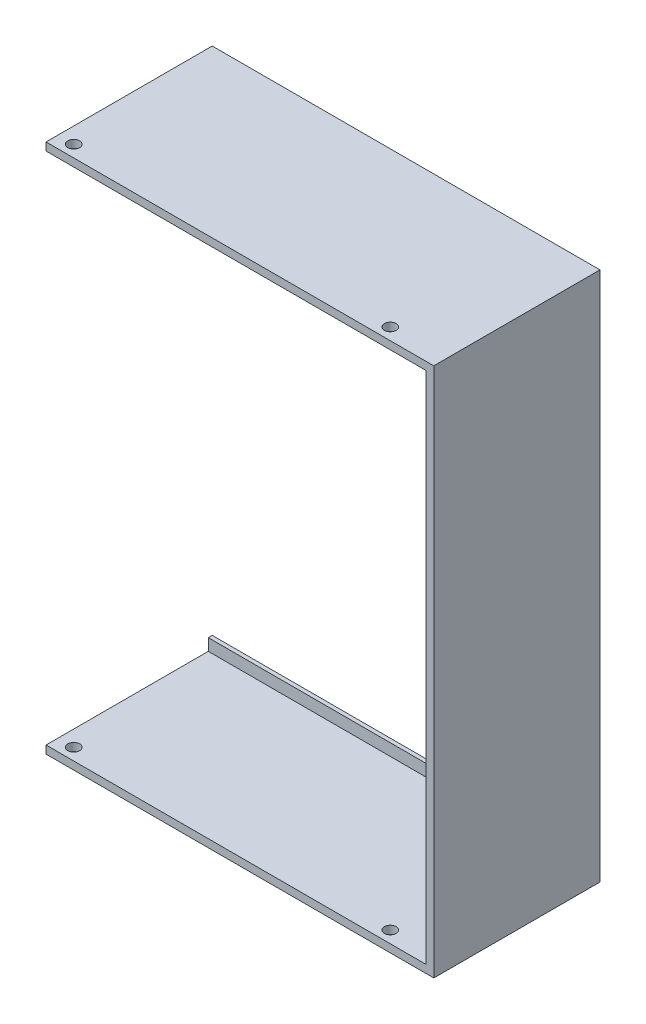
ISO-10303-21;
HEADER;
FILE_DESCRIPTION(('STEP AP214'),'2;1');
FILE_NAME('part.step','',(''),(''),'','','');
FILE_SCHEMA(('AUTOMOTIVE_DESIGN { 1 0 10303 214 1 1 1 1 }'));
ENDSEC;
DATA;
#1=APPLICATION_CONTEXT('core data for automotive mechanical design processes');
#2=APPLICATION_PROTOCOL_DEFINITION('international standard','automotive_design',2000,#1);
#3=PRODUCT_CONTEXT('',#1,'mechanical');
#4=PRODUCT('Part','Part','',(#3));
#5=PRODUCT_RELATED_PRODUCT_CATEGORY('part','',(#4));
#6=PRODUCT_DEFINITION_FORMATION('','',#4);
#7=PRODUCT_DEFINITION_CONTEXT('part definition',#1,'design');
#8=PRODUCT_DEFINITION('design','',#6,#7);
#9=PRODUCT_DEFINITION_SHAPE('','',#8);
#10=(LENGTH_UNIT() NAMED_UNIT(*) SI_UNIT(.MILLI.,.METRE.));
#11=(NAMED_UNIT(*) PLANE_ANGLE_UNIT() SI_UNIT($,.RADIAN.));
#12=(NAMED_UNIT(*) SI_UNIT($,.STERADIAN.) SOLID_ANGLE_UNIT());
#13=UNCERTAINTY_MEASURE_WITH_UNIT(LENGTH_MEASURE(1.E-05),#10,'distance_accuracy_value','');
#14=(GEOMETRIC_REPRESENTATION_CONTEXT(3) GLOBAL_UNCERTAINTY_ASSIGNED_CONTEXT((#13)) GLOBAL_UNIT_ASSIGNED_CONTEXT((#10,
#11,#12)) REPRESENTATION_CONTEXT('',''));
#15=CARTESIAN_POINT('',(0.,0.,0.));
#16=DIRECTION('',(0.,0.,1.));
#17=DIRECTION('',(1.,0.,0.));
#18=AXIS2_PLACEMENT_3D('',#15,#16,#17);
#19=CARTESIAN_POINT('',(0.,2.,0.));
#20=DIRECTION('',(0.,-1.,0.));
#21=DIRECTION('',(0.,0.,-1.));
#22=AXIS2_PLACEMENT_3D('',#19,#20,#21);
#23=PLANE('',#22);
#24=CARTESIAN_POINT('',(80.,2.,0.));
#25=DIRECTION('',(0.,1.,0.));
#26=DIRECTION('',(0.,0.,1.));
#27=AXIS2_PLACEMENT_3D('',#24,#25,#26);
#28=CIRCLE('',#27,1.5);
#29=CARTESIAN_POINT('',(80.,2.,1.5));
#30=VERTEX_POINT('',#29);
#31=EDGE_CURVE('E198',#30,#30,#28,.T.);
#32=ORIENTED_EDGE('',*,*,#31,.F.);
#33=EDGE_LOOP('',(#32));
#34=FACE_BOUND('',#33,.T.);
#35=CARTESIAN_POINT('',(0.,2.,0.));
#36=DIRECTION('',(0.,1.,0.));
#37=DIRECTION('',(0.,0.,1.));
#38=AXIS2_PLACEMENT_3D('',#35,#36,#37);
#39=CIRCLE('',#38,1.5);
#40=CARTESIAN_POINT('',(0.,2.,1.5));
#41=VERTEX_POINT('',#40);
#42=EDGE_CURVE('E204',#41,#41,#39,.T.);
#43=ORIENTED_EDGE('',*,*,#42,.F.);
#44=EDGE_LOOP('',(#43));
#45=FACE_BOUND('',#44,.T.);
#46=DIRECTION('',(0.,0.,1.));
#47=VECTOR('',#46,1.);
#48=CARTESIAN_POINT('',(92.,2.,-3.));
#49=LINE('',#48,#47);
#50=CARTESIAN_POINT('',(92.,2.,-38.));
#51=VERTEX_POINT('',#50);
#52=CARTESIAN_POINT('',(92.,2.,3.));
#53=VERTEX_POINT('',#52);
#54=EDGE_CURVE('E192',#51,#53,#49,.T.);
#55=ORIENTED_EDGE('',*,*,#54,.F.);
#56=DIRECTION('',(1.,0.,0.));
#57=VECTOR('',#56,1.);
#58=CARTESIAN_POINT('',(-4.,2.,-38.));
#59=LINE('',#58,#57);
#60=CARTESIAN_POINT('',(-4.,2.,-38.));
#61=VERTEX_POINT('',#60);
#62=EDGE_CURVE('E151',#61,#51,#59,.T.);
#63=ORIENTED_EDGE('',*,*,#62,.F.);
#64=DIRECTION('',(0.,0.,1.));
#65=VECTOR('',#64,1.);
#66=CARTESIAN_POINT('',(-4.,2.,3.));
#67=LINE('',#66,#65);
#68=CARTESIAN_POINT('',(-4.,2.,3.));
#69=VERTEX_POINT('',#68);
#70=EDGE_CURVE('E210',#61,#69,#67,.T.);
#71=ORIENTED_EDGE('',*,*,#70,.T.);
#72=DIRECTION('',(1.,0.,0.));
#73=VECTOR('',#72,1.);
#74=CARTESIAN_POINT('',(-4.,2.,3.));
#75=LINE('',#74,#73);
#76=EDGE_CURVE('E48',#69,#53,#75,.T.);
#77=ORIENTED_EDGE('',*,*,#76,.T.);
#78=EDGE_LOOP('',(#55,#63,#71,#77));
#79=FACE_BOUND('',#78,.T.);
#80=ADVANCED_FACE('F33',(#34,#45,#79),#23,.F.);
#81=CARTESIAN_POINT('',(0.,0.,0.));
#82=DIRECTION('',(0.,-1.,0.));
#83=DIRECTION('',(0.,0.,-1.));
#84=AXIS2_PLACEMENT_3D('',#81,#82,#83);
#85=PLANE('',#84);
#86=CARTESIAN_POINT('',(0.,0.,0.));
#87=DIRECTION('',(0.,1.,0.));
#88=DIRECTION('',(0.,0.,1.));
#89=AXIS2_PLACEMENT_3D('',#86,#87,#88);
#90=CIRCLE('',#89,1.5);
#91=CARTESIAN_POINT('',(0.,0.,1.5));
#92=VERTEX_POINT('',#91);
#93=EDGE_CURVE('E201',#92,#92,#90,.T.);
#94=ORIENTED_EDGE('',*,*,#93,.T.);
#95=EDGE_LOOP('',(#94));
#96=FACE_BOUND('',#95,.T.);
#97=DIRECTION('',(0.,0.,1.));
#98=VECTOR('',#97,1.);
#99=CARTESIAN_POINT('',(-4.,0.,3.));
#100=LINE('',#99,#98);
#101=CARTESIAN_POINT('',(-4.,0.,-39.));
#102=VERTEX_POINT('',#101);
#103=CARTESIAN_POINT('',(-4.,0.,3.));
#104=VERTEX_POINT('',#103);
#105=EDGE_CURVE('E207',#102,#104,#100,.T.);
#106=ORIENTED_EDGE('',*,*,#105,.F.);
#107=DIRECTION('',(-1.,0.,0.));
#108=VECTOR('',#107,1.);
#109=CARTESIAN_POINT('',(-4.,0.,-39.));
#110=LINE('',#109,#108);
#111=CARTESIAN_POINT('',(94.,0.,-39.));
#112=VERTEX_POINT('',#111);
#113=EDGE_CURVE('E143',#112,#102,#110,.T.);
#114=ORIENTED_EDGE('',*,*,#113,.F.);
#115=DIRECTION('',(0.,0.,-1.));
#116=VECTOR('',#115,1.);
#117=CARTESIAN_POINT('',(94.,0.,3.));
#118=LINE('',#117,#116);
#119=CARTESIAN_POINT('',(94.,0.,3.));
#120=VERTEX_POINT('',#119);
#121=EDGE_CURVE('E212',#120,#112,#118,.T.);
#122=ORIENTED_EDGE('',*,*,#121,.F.);
#123=DIRECTION('',(1.,0.,0.));
#124=VECTOR('',#123,1.);
#125=CARTESIAN_POINT('',(-4.,0.,3.));
#126=LINE('',#125,#124);
#127=EDGE_CURVE('E59',#104,#120,#126,.T.);
#128=ORIENTED_EDGE('',*,*,#127,.F.);
#129=EDGE_LOOP('',(#106,#114,#122,#128));
#130=FACE_BOUND('',#129,.T.);
#131=CARTESIAN_POINT('',(80.,0.,0.));
#132=DIRECTION('',(0.,1.,0.));
#133=DIRECTION('',(0.,0.,1.));
#134=AXIS2_PLACEMENT_3D('',#131,#132,#133);
#135=CIRCLE('',#134,1.5);
#136=CARTESIAN_POINT('',(80.,0.,1.5));
#137=VERTEX_POINT('',#136);
#138=EDGE_CURVE('E197',#137,#137,#135,.T.);
#139=ORIENTED_EDGE('',*,*,#138,.T.);
#140=EDGE_LOOP('',(#139));
#141=FACE_BOUND('',#140,.T.);
#142=ADVANCED_FACE('F222',(#96,#130,#141),#85,.T.);
#143=CARTESIAN_POINT('',(-4.,2.,3.));
#144=DIRECTION('',(1.,0.,0.));
#145=DIRECTION('',(0.,0.,-1.));
#146=AXIS2_PLACEMENT_3D('',#143,#144,#145);
#147=PLANE('',#146);
#148=ORIENTED_EDGE('',*,*,#105,.T.);
#149=DIRECTION('',(0.,-1.,0.));
#150=VECTOR('',#149,1.);
#151=CARTESIAN_POINT('',(-4.,2.,3.));
#152=LINE('',#151,#150);
#153=EDGE_CURVE('E11',#69,#104,#152,.T.);
#154=ORIENTED_EDGE('',*,*,#153,.F.);
#155=ORIENTED_EDGE('',*,*,#70,.F.);
#156=DIRECTION('',(0.,1.,0.));
#157=VECTOR('',#156,1.);
#158=CARTESIAN_POINT('',(-4.,0.,-38.));
#159=LINE('',#158,#157);
#160=CARTESIAN_POINT('',(-4.,5.,-38.));
#161=VERTEX_POINT('',#160);
#162=EDGE_CURVE('E149',#61,#161,#159,.T.);
#163=ORIENTED_EDGE('',*,*,#162,.T.);
#164=DIRECTION('',(0.,0.,1.));
#165=VECTOR('',#164,1.);
#166=CARTESIAN_POINT('',(-4.,5.,-39.));
#167=LINE('',#166,#165);
#168=CARTESIAN_POINT('',(-4.,5.,-39.));
#169=VERTEX_POINT('',#168);
#170=EDGE_CURVE('E130',#169,#161,#167,.T.);
#171=ORIENTED_EDGE('',*,*,#170,.F.);
#172=DIRECTION('',(0.,1.,0.));
#173=VECTOR('',#172,1.);
#174=CARTESIAN_POINT('',(-4.,0.,-39.));
#175=LINE('',#174,#173);
#176=EDGE_CURVE('E136',#102,#169,#175,.T.);
#177=ORIENTED_EDGE('',*,*,#176,.F.);
#178=EDGE_LOOP('',(#148,#154,#155,#163,#171,#177));
#179=FACE_BOUND('',#178,.T.);
#180=ADVANCED_FACE('F35',(#179),#147,.F.);
#181=CARTESIAN_POINT('',(-4.,2.,3.));
#182=DIRECTION('',(0.,0.,-1.));
#183=DIRECTION('',(-1.,0.,0.));
#184=AXIS2_PLACEMENT_3D('',#181,#182,#183);
#185=PLANE('',#184);
#186=ORIENTED_EDGE('',*,*,#127,.T.);
#187=DIRECTION('',(0.,-1.,0.));
#188=VECTOR('',#187,1.);
#189=CARTESIAN_POINT('',(94.,2.,3.));
#190=LINE('',#189,#188);
#191=CARTESIAN_POINT('',(94.,134.,3.));
#192=VERTEX_POINT('',#191);
#193=EDGE_CURVE('E42',#192,#120,#190,.T.);
#194=ORIENTED_EDGE('',*,*,#193,.F.);
#195=DIRECTION('',(1.,0.,0.));
#196=VECTOR('',#195,1.);
#197=CARTESIAN_POINT('',(94.,134.,3.));
#198=LINE('',#197,#196);
#199=CARTESIAN_POINT('',(-4.,134.,3.));
#200=VERTEX_POINT('',#199);
#201=EDGE_CURVE('E183',#200,#192,#198,.T.);
#202=ORIENTED_EDGE('',*,*,#201,.F.);
#203=DIRECTION('',(0.,-1.,0.));
#204=VECTOR('',#203,1.);
#205=CARTESIAN_POINT('',(-4.,134.,3.));
#206=LINE('',#205,#204);
#207=CARTESIAN_POINT('',(-4.,132.,3.));
#208=VERTEX_POINT('',#207);
#209=EDGE_CURVE('E186',#200,#208,#206,.T.);
#210=ORIENTED_EDGE('',*,*,#209,.T.);
#211=DIRECTION('',(1.,0.,0.));
#212=VECTOR('',#211,1.);
#213=CARTESIAN_POINT('',(94.,132.,3.));
#214=LINE('',#213,#212);
#215=CARTESIAN_POINT('',(92.,132.,3.));
#216=VERTEX_POINT('',#215);
#217=EDGE_CURVE('E181',#208,#216,#214,.T.);
#218=ORIENTED_EDGE('',*,*,#217,.T.);
#219=DIRECTION('',(0.,-1.,0.));
#220=VECTOR('',#219,1.);
#221=CARTESIAN_POINT('',(92.,132.,3.));
#222=LINE('',#221,#220);
#223=EDGE_CURVE('E68',#216,#53,#222,.T.);
#224=ORIENTED_EDGE('',*,*,#223,.T.);
#225=ORIENTED_EDGE('',*,*,#76,.F.);
#226=ORIENTED_EDGE('',*,*,#153,.T.);
#227=EDGE_LOOP('',(#186,#194,#202,#210,#218,#224,#225,#226));
#228=FACE_BOUND('',#227,.T.);
#229=ADVANCED_FACE('F290',(#228),#185,.F.);
#230=CARTESIAN_POINT('',(94.,2.,3.));
#231=DIRECTION('',(-1.,0.,0.));
#232=DIRECTION('',(0.,0.,1.));
#233=AXIS2_PLACEMENT_3D('',#230,#231,#232);
#234=PLANE('',#233);
#235=ORIENTED_EDGE('',*,*,#121,.T.);
#236=DIRECTION('',(0.,-1.,0.));
#237=VECTOR('',#236,1.);
#238=CARTESIAN_POINT('',(94.,134.,-39.));
#239=LINE('',#238,#237);
#240=CARTESIAN_POINT('',(94.,134.,-39.));
#241=VERTEX_POINT('',#240);
#242=EDGE_CURVE('E225',#241,#112,#239,.T.);
#243=ORIENTED_EDGE('',*,*,#242,.F.);
#244=DIRECTION('',(0.,0.,-1.));
#245=VECTOR('',#244,1.);
#246=CARTESIAN_POINT('',(94.,134.,3.));
#247=LINE('',#246,#245);
#248=EDGE_CURVE('E178',#192,#241,#247,.T.);
#249=ORIENTED_EDGE('',*,*,#248,.F.);
#250=ORIENTED_EDGE('',*,*,#193,.T.);
#251=EDGE_LOOP('',(#235,#243,#249,#250));
#252=FACE_BOUND('',#251,.T.);
#253=ADVANCED_FACE('F219',(#252),#234,.F.);
#254=CARTESIAN_POINT('',(0.,2.,0.));
#255=DIRECTION('',(0.,-1.,0.));
#256=DIRECTION('',(0.,0.,-1.));
#257=AXIS2_PLACEMENT_3D('',#254,#255,#256);
#258=CYLINDRICAL_SURFACE('',#257,1.5);
#259=ORIENTED_EDGE('',*,*,#42,.T.);
#260=EDGE_LOOP('',(#259));
#261=FACE_BOUND('',#260,.T.);
#262=ORIENTED_EDGE('',*,*,#93,.F.);
#263=EDGE_LOOP('',(#262));
#264=FACE_BOUND('',#263,.T.);
#265=ADVANCED_FACE('F286',(#261,#264),#258,.F.);
#266=CARTESIAN_POINT('',(80.,2.,0.));
#267=DIRECTION('',(0.,-1.,0.));
#268=DIRECTION('',(0.,0.,-1.));
#269=AXIS2_PLACEMENT_3D('',#266,#267,#268);
#270=CYLINDRICAL_SURFACE('',#269,1.5);
#271=ORIENTED_EDGE('',*,*,#31,.T.);
#272=EDGE_LOOP('',(#271));
#273=FACE_BOUND('',#272,.T.);
#274=ORIENTED_EDGE('',*,*,#138,.F.);
#275=EDGE_LOOP('',(#274));
#276=FACE_BOUND('',#275,.T.);
#277=ADVANCED_FACE('F323',(#273,#276),#270,.F.);
#278=CARTESIAN_POINT('',(92.,132.,-3.));
#279=DIRECTION('',(1.,0.,0.));
#280=DIRECTION('',(0.,0.,-1.));
#281=AXIS2_PLACEMENT_3D('',#278,#279,#280);
#282=PLANE('',#281);
#283=ORIENTED_EDGE('',*,*,#54,.T.);
#284=ORIENTED_EDGE('',*,*,#223,.F.);
#285=DIRECTION('',(0.,0.,1.));
#286=VECTOR('',#285,1.);
#287=CARTESIAN_POINT('',(92.,132.,-3.));
#288=LINE('',#287,#286);
#289=CARTESIAN_POINT('',(92.,132.,-38.));
#290=VERTEX_POINT('',#289);
#291=EDGE_CURVE('E193',#290,#216,#288,.T.);
#292=ORIENTED_EDGE('',*,*,#291,.F.);
#293=DIRECTION('',(0.,1.,0.));
#294=VECTOR('',#293,1.);
#295=CARTESIAN_POINT('',(92.,132.,-38.));
#296=LINE('',#295,#294);
#297=EDGE_CURVE('E154',#51,#290,#296,.T.);
#298=ORIENTED_EDGE('',*,*,#297,.F.);
#299=EDGE_LOOP('',(#283,#284,#292,#298));
#300=FACE_BOUND('',#299,.T.);
#301=ADVANCED_FACE('F298',(#300),#282,.F.);
#302=CARTESIAN_POINT('',(0.,132.,0.));
#303=DIRECTION('',(0.,1.,0.));
#304=DIRECTION('',(0.,0.,1.));
#305=AXIS2_PLACEMENT_3D('',#302,#303,#304);
#306=PLANE('',#305);
#307=CARTESIAN_POINT('',(0.,132.,0.));
#308=DIRECTION('',(0.,1.,0.));
#309=DIRECTION('',(0.,0.,1.));
#310=AXIS2_PLACEMENT_3D('',#307,#308,#309);
#311=CIRCLE('',#310,1.5);
#312=CARTESIAN_POINT('',(0.,132.,1.5));
#313=VERTEX_POINT('',#312);
#314=EDGE_CURVE('E169',#313,#313,#311,.T.);
#315=ORIENTED_EDGE('',*,*,#314,.T.);
#316=EDGE_LOOP('',(#315));
#317=FACE_BOUND('',#316,.T.);
#318=CARTESIAN_POINT('',(80.,132.,0.));
#319=DIRECTION('',(0.,1.,0.));
#320=DIRECTION('',(0.,0.,1.));
#321=AXIS2_PLACEMENT_3D('',#318,#319,#320);
#322=CIRCLE('',#321,1.5);
#323=CARTESIAN_POINT('',(80.,132.,1.5));
#324=VERTEX_POINT('',#323);
#325=EDGE_CURVE('E165',#324,#324,#322,.T.);
#326=ORIENTED_EDGE('',*,*,#325,.T.);
#327=EDGE_LOOP('',(#326));
#328=FACE_BOUND('',#327,.T.);
#329=DIRECTION('',(0.,0.,1.));
#330=VECTOR('',#329,1.);
#331=CARTESIAN_POINT('',(-4.,132.,3.));
#332=LINE('',#331,#330);
#333=CARTESIAN_POINT('',(-4.,132.,-38.));
#334=VERTEX_POINT('',#333);
#335=EDGE_CURVE('E175',#334,#208,#332,.T.);
#336=ORIENTED_EDGE('',*,*,#335,.F.);
#337=DIRECTION('',(-1.,0.,0.));
#338=VECTOR('',#337,1.);
#339=CARTESIAN_POINT('',(-4.,132.,-38.));
#340=LINE('',#339,#338);
#341=EDGE_CURVE('E162',#290,#334,#340,.T.);
#342=ORIENTED_EDGE('',*,*,#341,.F.);
#343=ORIENTED_EDGE('',*,*,#291,.T.);
#344=ORIENTED_EDGE('',*,*,#217,.F.);
#345=EDGE_LOOP('',(#336,#342,#343,#344));
#346=FACE_BOUND('',#345,.T.);
#347=ADVANCED_FACE('F301',(#317,#328,#346),#306,.F.);
#348=CARTESIAN_POINT('',(0.,134.,0.));
#349=DIRECTION('',(0.,1.,0.));
#350=DIRECTION('',(0.,0.,1.));
#351=AXIS2_PLACEMENT_3D('',#348,#349,#350);
#352=PLANE('',#351);
#353=CARTESIAN_POINT('',(0.,134.,0.));
#354=DIRECTION('',(0.,1.,0.));
#355=DIRECTION('',(0.,0.,1.));
#356=AXIS2_PLACEMENT_3D('',#353,#354,#355);
#357=CIRCLE('',#356,1.5);
#358=CARTESIAN_POINT('',(0.,134.,1.5));
#359=VERTEX_POINT('',#358);
#360=EDGE_CURVE('E172',#359,#359,#357,.T.);
#361=ORIENTED_EDGE('',*,*,#360,.F.);
#362=EDGE_LOOP('',(#361));
#363=FACE_BOUND('',#362,.T.);
#364=ORIENTED_EDGE('',*,*,#248,.T.);
#365=DIRECTION('',(1.,0.,0.));
#366=VECTOR('',#365,1.);
#367=CARTESIAN_POINT('',(-4.,134.,-39.));
#368=LINE('',#367,#366);
#369=CARTESIAN_POINT('',(-4.,134.,-39.));
#370=VERTEX_POINT('',#369);
#371=EDGE_CURVE('E229',#370,#241,#368,.T.);
#372=ORIENTED_EDGE('',*,*,#371,.F.);
#373=DIRECTION('',(0.,0.,1.));
#374=VECTOR('',#373,1.);
#375=CARTESIAN_POINT('',(-4.,134.,3.));
#376=LINE('',#375,#374);
#377=EDGE_CURVE('E180',#370,#200,#376,.T.);
#378=ORIENTED_EDGE('',*,*,#377,.T.);
#379=ORIENTED_EDGE('',*,*,#201,.T.);
#380=EDGE_LOOP('',(#364,#372,#378,#379));
#381=FACE_BOUND('',#380,.T.);
#382=CARTESIAN_POINT('',(80.,134.,0.));
#383=DIRECTION('',(0.,1.,0.));
#384=DIRECTION('',(0.,0.,1.));
#385=AXIS2_PLACEMENT_3D('',#382,#383,#384);
#386=CIRCLE('',#385,1.5);
#387=CARTESIAN_POINT('',(80.,134.,1.5));
#388=VERTEX_POINT('',#387);
#389=EDGE_CURVE('E166',#388,#388,#386,.T.);
#390=ORIENTED_EDGE('',*,*,#389,.F.);
#391=EDGE_LOOP('',(#390));
#392=FACE_BOUND('',#391,.T.);
#393=ADVANCED_FACE('F303',(#363,#381,#392),#352,.T.);
#394=CARTESIAN_POINT('',(-4.,134.,3.));
#395=DIRECTION('',(1.,0.,0.));
#396=DIRECTION('',(0.,0.,-1.));
#397=AXIS2_PLACEMENT_3D('',#394,#395,#396);
#398=PLANE('',#397);
#399=ORIENTED_EDGE('',*,*,#335,.T.);
#400=ORIENTED_EDGE('',*,*,#209,.F.);
#401=ORIENTED_EDGE('',*,*,#377,.F.);
#402=DIRECTION('',(0.,1.,0.));
#403=VECTOR('',#402,1.);
#404=CARTESIAN_POINT('',(-4.,134.,-39.));
#405=LINE('',#404,#403);
#406=CARTESIAN_POINT('',(-4.,129.,-39.));
#407=VERTEX_POINT('',#406);
#408=EDGE_CURVE('E260',#407,#370,#405,.T.);
#409=ORIENTED_EDGE('',*,*,#408,.F.);
#410=DIRECTION('',(0.,0.,1.));
#411=VECTOR('',#410,1.);
#412=CARTESIAN_POINT('',(-4.,129.,-39.));
#413=LINE('',#412,#411);
#414=CARTESIAN_POINT('',(-4.,129.,-38.));
#415=VERTEX_POINT('',#414);
#416=EDGE_CURVE('E224',#407,#415,#413,.T.);
#417=ORIENTED_EDGE('',*,*,#416,.T.);
#418=DIRECTION('',(0.,1.,0.));
#419=VECTOR('',#418,1.);
#420=CARTESIAN_POINT('',(-4.,134.,-38.));
#421=LINE('',#420,#419);
#422=EDGE_CURVE('E146',#415,#334,#421,.T.);
#423=ORIENTED_EDGE('',*,*,#422,.T.);
#424=EDGE_LOOP('',(#399,#400,#401,#409,#417,#423));
#425=FACE_BOUND('',#424,.T.);
#426=ADVANCED_FACE('F256',(#425),#398,.F.);
#427=CARTESIAN_POINT('',(0.,134.,0.));
#428=DIRECTION('',(0.,-1.,0.));
#429=DIRECTION('',(0.,0.,-1.));
#430=AXIS2_PLACEMENT_3D('',#427,#428,#429);
#431=CYLINDRICAL_SURFACE('',#430,1.5);
#432=ORIENTED_EDGE('',*,*,#360,.T.);
#433=EDGE_LOOP('',(#432));
#434=FACE_BOUND('',#433,.T.);
#435=ORIENTED_EDGE('',*,*,#314,.F.);
#436=EDGE_LOOP('',(#435));
#437=FACE_BOUND('',#436,.T.);
#438=ADVANCED_FACE('F313',(#434,#437),#431,.F.);
#439=CARTESIAN_POINT('',(80.,134.,0.));
#440=DIRECTION('',(0.,-1.,0.));
#441=DIRECTION('',(0.,0.,-1.));
#442=AXIS2_PLACEMENT_3D('',#439,#440,#441);
#443=CYLINDRICAL_SURFACE('',#442,1.5);
#444=ORIENTED_EDGE('',*,*,#389,.T.);
#445=EDGE_LOOP('',(#444));
#446=FACE_BOUND('',#445,.T.);
#447=ORIENTED_EDGE('',*,*,#325,.F.);
#448=EDGE_LOOP('',(#447));
#449=FACE_BOUND('',#448,.T.);
#450=ADVANCED_FACE('F310',(#446,#449),#443,.F.);
#451=CARTESIAN_POINT('',(0.,0.,-38.));
#452=DIRECTION('',(0.,0.,-1.));
#453=DIRECTION('',(-1.,0.,0.));
#454=AXIS2_PLACEMENT_3D('',#451,#452,#453);
#455=PLANE('',#454);
#456=ORIENTED_EDGE('',*,*,#162,.F.);
#457=ORIENTED_EDGE('',*,*,#62,.T.);
#458=ORIENTED_EDGE('',*,*,#297,.T.);
#459=ORIENTED_EDGE('',*,*,#341,.T.);
#460=ORIENTED_EDGE('',*,*,#422,.F.);
#461=DIRECTION('',(-1.,0.,0.));
#462=VECTOR('',#461,1.);
#463=CARTESIAN_POINT('',(-4.,129.,-38.));
#464=LINE('',#463,#462);
#465=CARTESIAN_POINT('',(89.,129.,-38.));
#466=VERTEX_POINT('',#465);
#467=EDGE_CURVE('E238',#466,#415,#464,.T.);
#468=ORIENTED_EDGE('',*,*,#467,.F.);
#469=DIRECTION('',(0.,1.,0.));
#470=VECTOR('',#469,1.);
#471=CARTESIAN_POINT('',(89.,129.,-38.));
#472=LINE('',#471,#470);
#473=CARTESIAN_POINT('',(89.,4.99999999999999,-38.));
#474=VERTEX_POINT('',#473);
#475=EDGE_CURVE('E236',#474,#466,#472,.T.);
#476=ORIENTED_EDGE('',*,*,#475,.F.);
#477=DIRECTION('',(1.,0.,0.));
#478=VECTOR('',#477,1.);
#479=CARTESIAN_POINT('',(-4.,5.,-38.));
#480=LINE('',#479,#478);
#481=EDGE_CURVE('E234',#161,#474,#480,.T.);
#482=ORIENTED_EDGE('',*,*,#481,.F.);
#483=EDGE_LOOP('',(#456,#457,#458,#459,#460,#468,#476,#482));
#484=FACE_BOUND('',#483,.T.);
#485=ADVANCED_FACE('F253',(#484),#455,.F.);
#486=CARTESIAN_POINT('',(-4.,5.,-39.));
#487=DIRECTION('',(0.,-1.,0.));
#488=DIRECTION('',(1.,0.,0.));
#489=AXIS2_PLACEMENT_3D('',#486,#487,#488);
#490=PLANE('',#489);
#491=ORIENTED_EDGE('',*,*,#481,.T.);
#492=DIRECTION('',(0.,0.,1.));
#493=VECTOR('',#492,1.);
#494=CARTESIAN_POINT('',(89.,4.99999999999999,-39.));
#495=LINE('',#494,#493);
#496=CARTESIAN_POINT('',(89.,4.99999999999999,-39.));
#497=VERTEX_POINT('',#496);
#498=EDGE_CURVE('E132',#497,#474,#495,.T.);
#499=ORIENTED_EDGE('',*,*,#498,.F.);
#500=DIRECTION('',(1.,0.,0.));
#501=VECTOR('',#500,1.);
#502=CARTESIAN_POINT('',(-4.,5.,-39.));
#503=LINE('',#502,#501);
#504=EDGE_CURVE('E126',#169,#497,#503,.T.);
#505=ORIENTED_EDGE('',*,*,#504,.F.);
#506=ORIENTED_EDGE('',*,*,#170,.T.);
#507=EDGE_LOOP('',(#491,#499,#505,#506));
#508=FACE_BOUND('',#507,.T.);
#509=ADVANCED_FACE('F128',(#508),#490,.F.);
#510=CARTESIAN_POINT('',(89.,129.,-39.));
#511=DIRECTION('',(1.,0.,0.));
#512=DIRECTION('',(0.,1.,0.));
#513=AXIS2_PLACEMENT_3D('',#510,#511,#512);
#514=PLANE('',#513);
#515=ORIENTED_EDGE('',*,*,#475,.T.);
#516=DIRECTION('',(0.,0.,1.));
#517=VECTOR('',#516,1.);
#518=CARTESIAN_POINT('',(89.,129.,-39.));
#519=LINE('',#518,#517);
#520=CARTESIAN_POINT('',(89.,129.,-39.));
#521=VERTEX_POINT('',#520);
#522=EDGE_CURVE('E156',#521,#466,#519,.T.);
#523=ORIENTED_EDGE('',*,*,#522,.F.);
#524=DIRECTION('',(0.,1.,0.));
#525=VECTOR('',#524,1.);
#526=CARTESIAN_POINT('',(89.,129.,-39.));
#527=LINE('',#526,#525);
#528=EDGE_CURVE('E135',#497,#521,#527,.T.);
#529=ORIENTED_EDGE('',*,*,#528,.F.);
#530=ORIENTED_EDGE('',*,*,#498,.T.);
#531=EDGE_LOOP('',(#515,#523,#529,#530));
#532=FACE_BOUND('',#531,.T.);
#533=ADVANCED_FACE('F266',(#532),#514,.F.);
#534=CARTESIAN_POINT('',(-4.,129.,-39.));
#535=DIRECTION('',(0.,1.,0.));
#536=DIRECTION('',(0.,0.,1.));
#537=AXIS2_PLACEMENT_3D('',#534,#535,#536);
#538=PLANE('',#537);
#539=ORIENTED_EDGE('',*,*,#467,.T.);
#540=ORIENTED_EDGE('',*,*,#416,.F.);
#541=DIRECTION('',(-1.,0.,0.));
#542=VECTOR('',#541,1.);
#543=CARTESIAN_POINT('',(-4.,129.,-39.));
#544=LINE('',#543,#542);
#545=EDGE_CURVE('E248',#521,#407,#544,.T.);
#546=ORIENTED_EDGE('',*,*,#545,.F.);
#547=ORIENTED_EDGE('',*,*,#522,.T.);
#548=EDGE_LOOP('',(#539,#540,#546,#547));
#549=FACE_BOUND('',#548,.T.);
#550=ADVANCED_FACE('F246',(#549),#538,.F.);
#551=CARTESIAN_POINT('',(0.,0.,-39.));
#552=DIRECTION('',(0.,0.,-1.));
#553=DIRECTION('',(-1.,0.,0.));
#554=AXIS2_PLACEMENT_3D('',#551,#552,#553);
#555=PLANE('',#554);
#556=ORIENTED_EDGE('',*,*,#176,.T.);
#557=ORIENTED_EDGE('',*,*,#504,.T.);
#558=ORIENTED_EDGE('',*,*,#528,.T.);
#559=ORIENTED_EDGE('',*,*,#545,.T.);
#560=ORIENTED_EDGE('',*,*,#408,.T.);
#561=ORIENTED_EDGE('',*,*,#371,.T.);
#562=ORIENTED_EDGE('',*,*,#242,.T.);
#563=ORIENTED_EDGE('',*,*,#113,.T.);
#564=EDGE_LOOP('',(#556,#557,#558,#559,#560,#561,#562,#563));
#565=FACE_BOUND('',#564,.T.);
#566=ADVANCED_FACE('F140',(#565),#555,.T.);
#567=CLOSED_SHELL('',(#80,#142,#180,#229,#253,#265,#277,#301,#347,#393,#426,#438,#450,#485,#509,
#533,#550,#566));
#568=MANIFOLD_SOLID_BREP('B2',#567);
#569=ADVANCED_BREP_SHAPE_REPRESENTATION('',(#18,#568),#14);
#570=SHAPE_DEFINITION_REPRESENTATION(#9,#569);
ENDSEC;
END-ISO-10303-21;
